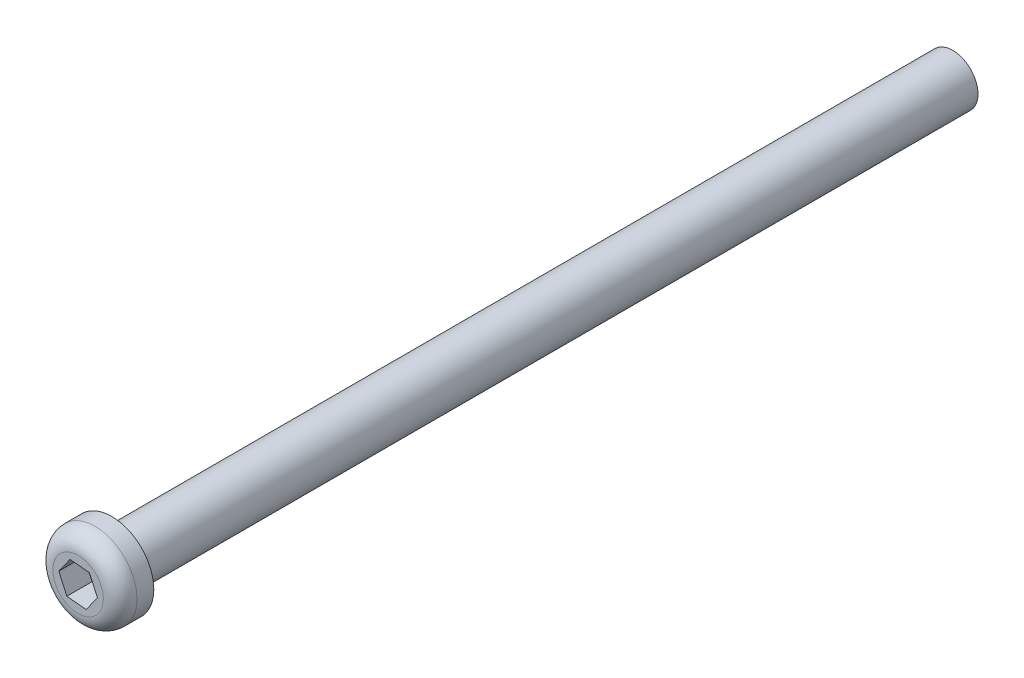
ISO-10303-21;
HEADER;
FILE_DESCRIPTION(('STEP AP214'),'2;1');
FILE_NAME('part.step','',(''),(''),'','','');
FILE_SCHEMA(('AUTOMOTIVE_DESIGN { 1 0 10303 214 1 1 1 1 }'));
ENDSEC;
DATA;
#1=APPLICATION_CONTEXT('core data for automotive mechanical design processes');
#2=APPLICATION_PROTOCOL_DEFINITION('international standard','automotive_design',2000,#1);
#3=PRODUCT_CONTEXT('',#1,'mechanical');
#4=PRODUCT('Part','Part','',(#3));
#5=PRODUCT_RELATED_PRODUCT_CATEGORY('part','',(#4));
#6=PRODUCT_DEFINITION_FORMATION('','',#4);
#7=PRODUCT_DEFINITION_CONTEXT('part definition',#1,'design');
#8=PRODUCT_DEFINITION('design','',#6,#7);
#9=PRODUCT_DEFINITION_SHAPE('','',#8);
#10=(LENGTH_UNIT() NAMED_UNIT(*) SI_UNIT(.MILLI.,.METRE.));
#11=(NAMED_UNIT(*) PLANE_ANGLE_UNIT() SI_UNIT($,.RADIAN.));
#12=(NAMED_UNIT(*) SI_UNIT($,.STERADIAN.) SOLID_ANGLE_UNIT());
#13=UNCERTAINTY_MEASURE_WITH_UNIT(LENGTH_MEASURE(1.E-05),#10,'distance_accuracy_value','');
#14=(GEOMETRIC_REPRESENTATION_CONTEXT(3) GLOBAL_UNCERTAINTY_ASSIGNED_CONTEXT((#13)) GLOBAL_UNIT_ASSIGNED_CONTEXT((#10,
#11,#12)) REPRESENTATION_CONTEXT('',''));
#15=CARTESIAN_POINT('',(0.,0.,0.));
#16=DIRECTION('',(0.,0.,1.));
#17=DIRECTION('',(1.,0.,0.));
#18=AXIS2_PLACEMENT_3D('',#15,#16,#17);
#19=CARTESIAN_POINT('',(0.,0.,50.));
#20=DIRECTION('',(0.,0.,-1.));
#21=DIRECTION('',(-1.,0.,0.));
#22=AXIS2_PLACEMENT_3D('',#19,#20,#21);
#23=CYLINDRICAL_SURFACE('',#22,1.5);
#24=CARTESIAN_POINT('',(0.,0.,50.));
#25=DIRECTION('',(0.,0.,1.));
#26=DIRECTION('',(1.,0.,0.));
#27=AXIS2_PLACEMENT_3D('',#24,#25,#26);
#28=CIRCLE('',#27,1.5);
#29=CARTESIAN_POINT('',(1.5,0.,50.));
#30=VERTEX_POINT('',#29);
#31=EDGE_CURVE('E147',#30,#30,#28,.T.);
#32=ORIENTED_EDGE('',*,*,#31,.F.);
#33=EDGE_LOOP('',(#32));
#34=FACE_BOUND('',#33,.T.);
#35=CARTESIAN_POINT('',(0.,0.,0.));
#36=DIRECTION('',(0.,0.,1.));
#37=DIRECTION('',(1.,0.,0.));
#38=AXIS2_PLACEMENT_3D('',#35,#36,#37);
#39=CIRCLE('',#38,1.5);
#40=CARTESIAN_POINT('',(1.5,0.,0.));
#41=VERTEX_POINT('',#40);
#42=EDGE_CURVE('E146',#41,#41,#39,.T.);
#43=ORIENTED_EDGE('',*,*,#42,.T.);
#44=EDGE_LOOP('',(#43));
#45=FACE_BOUND('',#44,.T.);
#46=ADVANCED_FACE('F36',(#34,#45),#23,.T.);
#47=CARTESIAN_POINT('',(0.,0.,0.));
#48=DIRECTION('',(0.,0.,1.));
#49=DIRECTION('',(1.,0.,0.));
#50=AXIS2_PLACEMENT_3D('',#47,#48,#49);
#51=PLANE('',#50);
#52=ORIENTED_EDGE('',*,*,#42,.F.);
#53=EDGE_LOOP('',(#52));
#54=FACE_BOUND('',#53,.T.);
#55=ADVANCED_FACE('F166',(#54),#51,.F.);
#56=CARTESIAN_POINT('',(0.,0.,52.));
#57=DIRECTION('',(0.,0.,-1.));
#58=DIRECTION('',(-1.,0.,0.));
#59=AXIS2_PLACEMENT_3D('',#56,#57,#58);
#60=CYLINDRICAL_SURFACE('',#59,2.5);
#61=CARTESIAN_POINT('',(0.,0.,51.));
#62=DIRECTION('',(0.,0.,1.));
#63=DIRECTION('',(1.,0.,0.));
#64=AXIS2_PLACEMENT_3D('',#61,#62,#63);
#65=CIRCLE('',#64,2.5);
#66=CARTESIAN_POINT('',(2.5,0.,51.));
#67=VERTEX_POINT('',#66);
#68=EDGE_CURVE('E11',#67,#67,#65,.F.);
#69=ORIENTED_EDGE('',*,*,#68,.T.);
#70=EDGE_LOOP('',(#69));
#71=FACE_BOUND('',#70,.T.);
#72=CARTESIAN_POINT('',(0.,0.,50.));
#73=DIRECTION('',(0.,0.,1.));
#74=DIRECTION('',(1.,0.,0.));
#75=AXIS2_PLACEMENT_3D('',#72,#73,#74);
#76=CIRCLE('',#75,2.5);
#77=CARTESIAN_POINT('',(2.5,0.,50.));
#78=VERTEX_POINT('',#77);
#79=EDGE_CURVE('E138',#78,#78,#76,.T.);
#80=ORIENTED_EDGE('',*,*,#79,.T.);
#81=EDGE_LOOP('',(#80));
#82=FACE_BOUND('',#81,.T.);
#83=ADVANCED_FACE('F171',(#71,#82),#60,.T.);
#84=CARTESIAN_POINT('',(0.,0.,52.));
#85=DIRECTION('',(0.,0.,1.));
#86=DIRECTION('',(1.,0.,0.));
#87=AXIS2_PLACEMENT_3D('',#84,#85,#86);
#88=PLANE('',#87);
#89=CARTESIAN_POINT('',(0.,0.,52.));
#90=DIRECTION('',(0.,0.,1.));
#91=DIRECTION('',(1.,0.,0.));
#92=AXIS2_PLACEMENT_3D('',#89,#90,#91);
#93=CIRCLE('',#92,1.5);
#94=CARTESIAN_POINT('',(1.5,0.,52.));
#95=VERTEX_POINT('',#94);
#96=EDGE_CURVE('E44',#95,#95,#93,.T.);
#97=ORIENTED_EDGE('',*,*,#96,.T.);
#98=EDGE_LOOP('',(#97));
#99=FACE_BOUND('',#98,.T.);
#100=DIRECTION('',(0.57878591184661,0.815479532697104,0.));
#101=VECTOR('',#100,1.);
#102=CARTESIAN_POINT('',(0.4813173306893,-1.04960323956791,52.));
#103=LINE('',#102,#101);
#104=CARTESIAN_POINT('',(0.4813173306893,-1.04960323956791,52.));
#105=VERTEX_POINT('',#104);
#106=CARTESIAN_POINT('',(1.14964173470491,-0.107968584125307,52.));
#107=VERTEX_POINT('',#106);
#108=EDGE_CURVE('E51',#105,#107,#103,.T.);
#109=ORIENTED_EDGE('',*,*,#108,.F.);
#110=DIRECTION('',(0.99561894750526,-0.093503536663153,0.));
#111=VECTOR('',#110,1.);
#112=CARTESIAN_POINT('',(-0.668324404015607,-0.941634655442607,52.));
#113=LINE('',#112,#111);
#114=CARTESIAN_POINT('',(-0.668324404015607,-0.941634655442607,52.));
#115=VERTEX_POINT('',#114);
#116=EDGE_CURVE('E134',#115,#105,#113,.T.);
#117=ORIENTED_EDGE('',*,*,#116,.F.);
#118=DIRECTION('',(0.41683303565865,-0.908983069360257,0.));
#119=VECTOR('',#118,1.);
#120=CARTESIAN_POINT('',(-1.14964173470491,0.107968584125307,52.));
#121=LINE('',#120,#119);
#122=CARTESIAN_POINT('',(-1.14964173470491,0.107968584125307,52.));
#123=VERTEX_POINT('',#122);
#124=EDGE_CURVE('E132',#123,#115,#121,.T.);
#125=ORIENTED_EDGE('',*,*,#124,.F.);
#126=DIRECTION('',(-0.57878591184661,-0.815479532697105,0.));
#127=VECTOR('',#126,1.);
#128=CARTESIAN_POINT('',(-0.481317330689301,1.04960323956791,52.));
#129=LINE('',#128,#127);
#130=CARTESIAN_POINT('',(-0.481317330689301,1.04960323956791,52.));
#131=VERTEX_POINT('',#130);
#132=EDGE_CURVE('E99',#131,#123,#129,.T.);
#133=ORIENTED_EDGE('',*,*,#132,.F.);
#134=DIRECTION('',(-0.99561894750526,0.093503536663153,0.));
#135=VECTOR('',#134,1.);
#136=CARTESIAN_POINT('',(0.668324404015606,0.941634655442607,52.));
#137=LINE('',#136,#135);
#138=CARTESIAN_POINT('',(0.668324404015606,0.941634655442607,52.));
#139=VERTEX_POINT('',#138);
#140=EDGE_CURVE('E128',#139,#131,#137,.T.);
#141=ORIENTED_EDGE('',*,*,#140,.F.);
#142=DIRECTION('',(-0.41683303565865,0.908983069360257,0.));
#143=VECTOR('',#142,1.);
#144=CARTESIAN_POINT('',(1.14964173470491,-0.107968584125307,52.));
#145=LINE('',#144,#143);
#146=EDGE_CURVE('E125',#107,#139,#145,.T.);
#147=ORIENTED_EDGE('',*,*,#146,.F.);
#148=EDGE_LOOP('',(#109,#117,#125,#133,#141,#147));
#149=FACE_BOUND('',#148,.T.);
#150=ADVANCED_FACE('F154',(#99,#149),#88,.T.);
#151=CARTESIAN_POINT('',(0.,0.,50.));
#152=DIRECTION('',(0.,0.,1.));
#153=DIRECTION('',(1.,0.,0.));
#154=AXIS2_PLACEMENT_3D('',#151,#152,#153);
#155=PLANE('',#154);
#156=ORIENTED_EDGE('',*,*,#31,.T.);
#157=EDGE_LOOP('',(#156));
#158=FACE_BOUND('',#157,.T.);
#159=ORIENTED_EDGE('',*,*,#79,.F.);
#160=EDGE_LOOP('',(#159));
#161=FACE_BOUND('',#160,.T.);
#162=ADVANCED_FACE('F180',(#158,#161),#155,.F.);
#163=CARTESIAN_POINT('',(0.4813173306893,-1.04960323956791,50.5));
#164=DIRECTION('',(0.815479532697104,-0.57878591184661,0.));
#165=DIRECTION('',(0.57878591184661,0.815479532697104,0.));
#166=AXIS2_PLACEMENT_3D('',#163,#164,#165);
#167=PLANE('',#166);
#168=ORIENTED_EDGE('',*,*,#108,.T.);
#169=DIRECTION('',(0.,0.,1.));
#170=VECTOR('',#169,1.);
#171=CARTESIAN_POINT('',(1.14964173470491,-0.107968584125307,50.5));
#172=LINE('',#171,#170);
#173=CARTESIAN_POINT('',(1.14964173470491,-0.107968584125307,50.5));
#174=VERTEX_POINT('',#173);
#175=EDGE_CURVE('E81',#174,#107,#172,.T.);
#176=ORIENTED_EDGE('',*,*,#175,.F.);
#177=DIRECTION('',(0.57878591184661,0.815479532697104,0.));
#178=VECTOR('',#177,1.);
#179=CARTESIAN_POINT('',(0.4813173306893,-1.04960323956791,50.5));
#180=LINE('',#179,#178);
#181=CARTESIAN_POINT('',(0.4813173306893,-1.04960323956791,50.5));
#182=VERTEX_POINT('',#181);
#183=EDGE_CURVE('E136',#182,#174,#180,.T.);
#184=ORIENTED_EDGE('',*,*,#183,.F.);
#185=DIRECTION('',(0.,0.,1.));
#186=VECTOR('',#185,1.);
#187=CARTESIAN_POINT('',(0.4813173306893,-1.04960323956791,50.5));
#188=LINE('',#187,#186);
#189=EDGE_CURVE('E59',#182,#105,#188,.T.);
#190=ORIENTED_EDGE('',*,*,#189,.T.);
#191=EDGE_LOOP('',(#168,#176,#184,#190));
#192=FACE_BOUND('',#191,.T.);
#193=ADVANCED_FACE('F183',(#192),#167,.F.);
#194=CARTESIAN_POINT('',(-0.668324404015607,-0.941634655442607,50.5));
#195=DIRECTION('',(-0.093503536663153,-0.99561894750526,0.));
#196=DIRECTION('',(0.99561894750526,-0.093503536663153,0.));
#197=AXIS2_PLACEMENT_3D('',#194,#195,#196);
#198=PLANE('',#197);
#199=ORIENTED_EDGE('',*,*,#116,.T.);
#200=ORIENTED_EDGE('',*,*,#189,.F.);
#201=DIRECTION('',(0.99561894750526,-0.093503536663153,0.));
#202=VECTOR('',#201,1.);
#203=CARTESIAN_POINT('',(-0.668324404015607,-0.941634655442607,50.5));
#204=LINE('',#203,#202);
#205=CARTESIAN_POINT('',(-0.668324404015607,-0.941634655442607,50.5));
#206=VERTEX_POINT('',#205);
#207=EDGE_CURVE('E111',#206,#182,#204,.T.);
#208=ORIENTED_EDGE('',*,*,#207,.F.);
#209=DIRECTION('',(0.,0.,1.));
#210=VECTOR('',#209,1.);
#211=CARTESIAN_POINT('',(-0.668324404015607,-0.941634655442607,50.5));
#212=LINE('',#211,#210);
#213=EDGE_CURVE('E103',#206,#115,#212,.T.);
#214=ORIENTED_EDGE('',*,*,#213,.T.);
#215=EDGE_LOOP('',(#199,#200,#208,#214));
#216=FACE_BOUND('',#215,.T.);
#217=ADVANCED_FACE('F189',(#216),#198,.F.);
#218=CARTESIAN_POINT('',(-1.14964173470491,0.107968584125307,50.5));
#219=DIRECTION('',(-0.908983069360257,-0.41683303565865,0.));
#220=DIRECTION('',(0.41683303565865,-0.908983069360258,0.));
#221=AXIS2_PLACEMENT_3D('',#218,#219,#220);
#222=PLANE('',#221);
#223=ORIENTED_EDGE('',*,*,#124,.T.);
#224=ORIENTED_EDGE('',*,*,#213,.F.);
#225=DIRECTION('',(0.41683303565865,-0.908983069360257,0.));
#226=VECTOR('',#225,1.);
#227=CARTESIAN_POINT('',(-1.14964173470491,0.107968584125307,50.5));
#228=LINE('',#227,#226);
#229=CARTESIAN_POINT('',(-1.14964173470491,0.107968584125307,50.5));
#230=VERTEX_POINT('',#229);
#231=EDGE_CURVE('E107',#230,#206,#228,.T.);
#232=ORIENTED_EDGE('',*,*,#231,.F.);
#233=DIRECTION('',(0.,0.,1.));
#234=VECTOR('',#233,1.);
#235=CARTESIAN_POINT('',(-1.14964173470491,0.107968584125307,50.5));
#236=LINE('',#235,#234);
#237=EDGE_CURVE('E92',#230,#123,#236,.T.);
#238=ORIENTED_EDGE('',*,*,#237,.T.);
#239=EDGE_LOOP('',(#223,#224,#232,#238));
#240=FACE_BOUND('',#239,.T.);
#241=ADVANCED_FACE('F108',(#240),#222,.F.);
#242=CARTESIAN_POINT('',(-0.481317330689301,1.04960323956791,50.5));
#243=DIRECTION('',(-0.815479532697105,0.57878591184661,0.));
#244=DIRECTION('',(-0.57878591184661,-0.815479532697105,0.));
#245=AXIS2_PLACEMENT_3D('',#242,#243,#244);
#246=PLANE('',#245);
#247=ORIENTED_EDGE('',*,*,#132,.T.);
#248=ORIENTED_EDGE('',*,*,#237,.F.);
#249=DIRECTION('',(-0.57878591184661,-0.815479532697105,0.));
#250=VECTOR('',#249,1.);
#251=CARTESIAN_POINT('',(-0.481317330689301,1.04960323956791,50.5));
#252=LINE('',#251,#250);
#253=CARTESIAN_POINT('',(-0.481317330689301,1.04960323956791,50.5));
#254=VERTEX_POINT('',#253);
#255=EDGE_CURVE('E96',#254,#230,#252,.T.);
#256=ORIENTED_EDGE('',*,*,#255,.F.);
#257=DIRECTION('',(0.,0.,1.));
#258=VECTOR('',#257,1.);
#259=CARTESIAN_POINT('',(-0.481317330689301,1.04960323956791,50.5));
#260=LINE('',#259,#258);
#261=EDGE_CURVE('E104',#254,#131,#260,.T.);
#262=ORIENTED_EDGE('',*,*,#261,.T.);
#263=EDGE_LOOP('',(#247,#248,#256,#262));
#264=FACE_BOUND('',#263,.T.);
#265=ADVANCED_FACE('F94',(#264),#246,.F.);
#266=CARTESIAN_POINT('',(0.668324404015606,0.941634655442607,50.5));
#267=DIRECTION('',(0.093503536663153,0.99561894750526,0.));
#268=DIRECTION('',(-0.99561894750526,0.093503536663153,0.));
#269=AXIS2_PLACEMENT_3D('',#266,#267,#268);
#270=PLANE('',#269);
#271=ORIENTED_EDGE('',*,*,#140,.T.);
#272=ORIENTED_EDGE('',*,*,#261,.F.);
#273=DIRECTION('',(-0.99561894750526,0.093503536663153,0.));
#274=VECTOR('',#273,1.);
#275=CARTESIAN_POINT('',(0.668324404015606,0.941634655442607,50.5));
#276=LINE('',#275,#274);
#277=CARTESIAN_POINT('',(0.668324404015606,0.941634655442607,50.5));
#278=VERTEX_POINT('',#277);
#279=EDGE_CURVE('E117',#278,#254,#276,.T.);
#280=ORIENTED_EDGE('',*,*,#279,.F.);
#281=DIRECTION('',(0.,0.,1.));
#282=VECTOR('',#281,1.);
#283=CARTESIAN_POINT('',(0.668324404015606,0.941634655442607,50.5));
#284=LINE('',#283,#282);
#285=EDGE_CURVE('E141',#278,#139,#284,.T.);
#286=ORIENTED_EDGE('',*,*,#285,.T.);
#287=EDGE_LOOP('',(#271,#272,#280,#286));
#288=FACE_BOUND('',#287,.T.);
#289=ADVANCED_FACE('F192',(#288),#270,.F.);
#290=CARTESIAN_POINT('',(1.14964173470491,-0.107968584125307,50.5));
#291=DIRECTION('',(0.908983069360257,0.41683303565865,0.));
#292=DIRECTION('',(-0.41683303565865,0.908983069360257,0.));
#293=AXIS2_PLACEMENT_3D('',#290,#291,#292);
#294=PLANE('',#293);
#295=ORIENTED_EDGE('',*,*,#146,.T.);
#296=ORIENTED_EDGE('',*,*,#285,.F.);
#297=DIRECTION('',(-0.41683303565865,0.908983069360257,0.));
#298=VECTOR('',#297,1.);
#299=CARTESIAN_POINT('',(1.14964173470491,-0.107968584125307,50.5));
#300=LINE('',#299,#298);
#301=EDGE_CURVE('E119',#174,#278,#300,.T.);
#302=ORIENTED_EDGE('',*,*,#301,.F.);
#303=ORIENTED_EDGE('',*,*,#175,.T.);
#304=EDGE_LOOP('',(#295,#296,#302,#303));
#305=FACE_BOUND('',#304,.T.);
#306=ADVANCED_FACE('F162',(#305),#294,.F.);
#307=CARTESIAN_POINT('',(0.,0.,50.5));
#308=DIRECTION('',(0.,0.,1.));
#309=DIRECTION('',(1.,0.,0.));
#310=AXIS2_PLACEMENT_3D('',#307,#308,#309);
#311=PLANE('',#310);
#312=ORIENTED_EDGE('',*,*,#183,.T.);
#313=ORIENTED_EDGE('',*,*,#301,.T.);
#314=ORIENTED_EDGE('',*,*,#279,.T.);
#315=ORIENTED_EDGE('',*,*,#255,.T.);
#316=ORIENTED_EDGE('',*,*,#231,.T.);
#317=ORIENTED_EDGE('',*,*,#207,.T.);
#318=EDGE_LOOP('',(#312,#313,#314,#315,#316,#317));
#319=FACE_BOUND('',#318,.T.);
#320=ADVANCED_FACE('F114',(#319),#311,.T.);
#321=CARTESIAN_POINT('',(0.,0.,51.));
#322=DIRECTION('',(0.,0.,1.));
#323=DIRECTION('',(1.,0.,0.));
#324=AXIS2_PLACEMENT_3D('',#321,#322,#323);
#325=TOROIDAL_SURFACE('',#324,1.5,1.);
#326=ORIENTED_EDGE('',*,*,#68,.F.);
#327=EDGE_LOOP('',(#326));
#328=FACE_BOUND('',#327,.T.);
#329=ORIENTED_EDGE('',*,*,#96,.F.);
#330=EDGE_LOOP('',(#329));
#331=FACE_BOUND('',#330,.T.);
#332=ADVANCED_FACE('F38',(#328,#331),#325,.T.);
#333=CLOSED_SHELL('',(#46,#55,#83,#150,#162,#193,#217,#241,#265,#289,#306,#320,#332));
#334=MANIFOLD_SOLID_BREP('B2',#333);
#335=ADVANCED_BREP_SHAPE_REPRESENTATION('',(#18,#334),#14);
#336=SHAPE_DEFINITION_REPRESENTATION(#9,#335);
ENDSEC;
END-ISO-10303-21;
